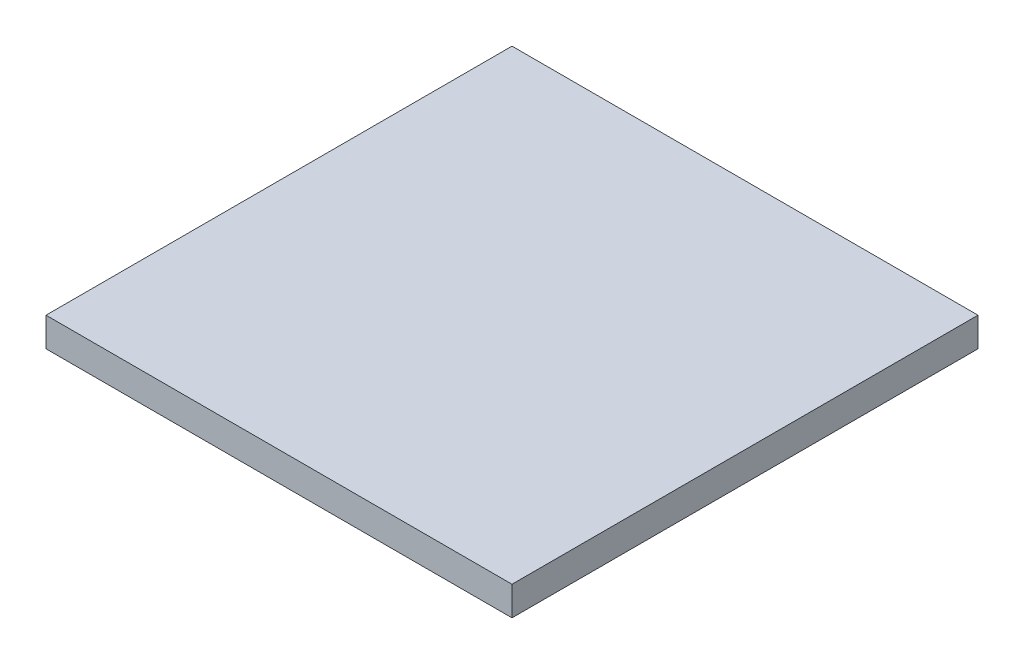
ISO-10303-21;
HEADER;
FILE_DESCRIPTION(('STEP AP214'),'2;1');
FILE_NAME('part.step','',(''),(''),'','','');
FILE_SCHEMA(('AUTOMOTIVE_DESIGN { 1 0 10303 214 1 1 1 1 }'));
ENDSEC;
DATA;
#1=APPLICATION_CONTEXT('core data for automotive mechanical design processes');
#2=APPLICATION_PROTOCOL_DEFINITION('international standard','automotive_design',2000,#1);
#3=PRODUCT_CONTEXT('',#1,'mechanical');
#4=PRODUCT('Part','Part','',(#3));
#5=PRODUCT_RELATED_PRODUCT_CATEGORY('part','',(#4));
#6=PRODUCT_DEFINITION_FORMATION('','',#4);
#7=PRODUCT_DEFINITION_CONTEXT('part definition',#1,'design');
#8=PRODUCT_DEFINITION('design','',#6,#7);
#9=PRODUCT_DEFINITION_SHAPE('','',#8);
#10=(LENGTH_UNIT() NAMED_UNIT(*) SI_UNIT(.MILLI.,.METRE.));
#11=(NAMED_UNIT(*) PLANE_ANGLE_UNIT() SI_UNIT($,.RADIAN.));
#12=(NAMED_UNIT(*) SI_UNIT($,.STERADIAN.) SOLID_ANGLE_UNIT());
#13=UNCERTAINTY_MEASURE_WITH_UNIT(LENGTH_MEASURE(1.E-05),#10,'distance_accuracy_value','');
#14=(GEOMETRIC_REPRESENTATION_CONTEXT(3) GLOBAL_UNCERTAINTY_ASSIGNED_CONTEXT((#13)) GLOBAL_UNIT_ASSIGNED_CONTEXT((#10,
#11,#12)) REPRESENTATION_CONTEXT('',''));
#15=CARTESIAN_POINT('',(0.,0.,0.));
#16=DIRECTION('',(0.,0.,1.));
#17=DIRECTION('',(1.,0.,0.));
#18=AXIS2_PLACEMENT_3D('',#15,#16,#17);
#19=CARTESIAN_POINT('',(0.,1.5875,0.));
#20=DIRECTION('',(1.,0.,0.));
#21=DIRECTION('',(0.,0.,-1.));
#22=AXIS2_PLACEMENT_3D('',#19,#20,#21);
#23=PLANE('',#22);
#24=DIRECTION('',(0.,0.,1.));
#25=VECTOR('',#24,1.);
#26=CARTESIAN_POINT('',(0.,0.,0.));
#27=LINE('',#26,#25);
#28=CARTESIAN_POINT('',(0.,0.,-25.4));
#29=VERTEX_POINT('',#28);
#30=CARTESIAN_POINT('',(0.,0.,0.));
#31=VERTEX_POINT('',#30);
#32=EDGE_CURVE('E98',#29,#31,#27,.T.);
#33=ORIENTED_EDGE('',*,*,#32,.T.);
#34=DIRECTION('',(0.,-1.,0.));
#35=VECTOR('',#34,1.);
#36=CARTESIAN_POINT('',(0.,1.5875,0.));
#37=LINE('',#36,#35);
#38=CARTESIAN_POINT('',(0.,1.5875,0.));
#39=VERTEX_POINT('',#38);
#40=EDGE_CURVE('E11',#39,#31,#37,.T.);
#41=ORIENTED_EDGE('',*,*,#40,.F.);
#42=DIRECTION('',(0.,0.,1.));
#43=VECTOR('',#42,1.);
#44=CARTESIAN_POINT('',(0.,1.5875,0.));
#45=LINE('',#44,#43);
#46=CARTESIAN_POINT('',(0.,1.5875,-25.4));
#47=VERTEX_POINT('',#46);
#48=EDGE_CURVE('E86',#47,#39,#45,.T.);
#49=ORIENTED_EDGE('',*,*,#48,.F.);
#50=DIRECTION('',(0.,-1.,0.));
#51=VECTOR('',#50,1.);
#52=CARTESIAN_POINT('',(0.,1.5875,-25.4));
#53=LINE('',#52,#51);
#54=EDGE_CURVE('E94',#47,#29,#53,.T.);
#55=ORIENTED_EDGE('',*,*,#54,.T.);
#56=EDGE_LOOP('',(#33,#41,#49,#55));
#57=FACE_BOUND('',#56,.T.);
#58=ADVANCED_FACE('F35',(#57),#23,.F.);
#59=CARTESIAN_POINT('',(0.,1.5875,0.));
#60=DIRECTION('',(0.,0.,-1.));
#61=DIRECTION('',(-1.,0.,0.));
#62=AXIS2_PLACEMENT_3D('',#59,#60,#61);
#63=PLANE('',#62);
#64=DIRECTION('',(1.,0.,0.));
#65=VECTOR('',#64,1.);
#66=CARTESIAN_POINT('',(0.,0.,0.));
#67=LINE('',#66,#65);
#68=CARTESIAN_POINT('',(25.4,0.,0.));
#69=VERTEX_POINT('',#68);
#70=EDGE_CURVE('E90',#31,#69,#67,.T.);
#71=ORIENTED_EDGE('',*,*,#70,.T.);
#72=DIRECTION('',(0.,-1.,0.));
#73=VECTOR('',#72,1.);
#74=CARTESIAN_POINT('',(25.4,1.5875,0.));
#75=LINE('',#74,#73);
#76=CARTESIAN_POINT('',(25.4,1.5875,0.));
#77=VERTEX_POINT('',#76);
#78=EDGE_CURVE('E43',#77,#69,#75,.T.);
#79=ORIENTED_EDGE('',*,*,#78,.F.);
#80=DIRECTION('',(1.,0.,0.));
#81=VECTOR('',#80,1.);
#82=CARTESIAN_POINT('',(0.,1.5875,0.));
#83=LINE('',#82,#81);
#84=EDGE_CURVE('E81',#39,#77,#83,.T.);
#85=ORIENTED_EDGE('',*,*,#84,.F.);
#86=ORIENTED_EDGE('',*,*,#40,.T.);
#87=EDGE_LOOP('',(#71,#79,#85,#86));
#88=FACE_BOUND('',#87,.T.);
#89=ADVANCED_FACE('F89',(#88),#63,.F.);
#90=CARTESIAN_POINT('',(25.4,1.5875,0.));
#91=DIRECTION('',(-1.,0.,0.));
#92=DIRECTION('',(0.,0.,1.));
#93=AXIS2_PLACEMENT_3D('',#90,#91,#92);
#94=PLANE('',#93);
#95=DIRECTION('',(0.,0.,-1.));
#96=VECTOR('',#95,1.);
#97=CARTESIAN_POINT('',(25.4,0.,0.));
#98=LINE('',#97,#96);
#99=CARTESIAN_POINT('',(25.4,0.,-25.4));
#100=VERTEX_POINT('',#99);
#101=EDGE_CURVE('E68',#69,#100,#98,.T.);
#102=ORIENTED_EDGE('',*,*,#101,.T.);
#103=DIRECTION('',(0.,-1.,0.));
#104=VECTOR('',#103,1.);
#105=CARTESIAN_POINT('',(25.4,1.5875,-25.4));
#106=LINE('',#105,#104);
#107=CARTESIAN_POINT('',(25.4,1.5875,-25.4));
#108=VERTEX_POINT('',#107);
#109=EDGE_CURVE('E91',#108,#100,#106,.T.);
#110=ORIENTED_EDGE('',*,*,#109,.F.);
#111=DIRECTION('',(0.,0.,-1.));
#112=VECTOR('',#111,1.);
#113=CARTESIAN_POINT('',(25.4,1.5875,0.));
#114=LINE('',#113,#112);
#115=EDGE_CURVE('E84',#77,#108,#114,.T.);
#116=ORIENTED_EDGE('',*,*,#115,.F.);
#117=ORIENTED_EDGE('',*,*,#78,.T.);
#118=EDGE_LOOP('',(#102,#110,#116,#117));
#119=FACE_BOUND('',#118,.T.);
#120=ADVANCED_FACE('F92',(#119),#94,.F.);
#121=CARTESIAN_POINT('',(0.,1.5875,-25.4));
#122=DIRECTION('',(0.,0.,1.));
#123=DIRECTION('',(1.,0.,0.));
#124=AXIS2_PLACEMENT_3D('',#121,#122,#123);
#125=PLANE('',#124);
#126=DIRECTION('',(-1.,0.,0.));
#127=VECTOR('',#126,1.);
#128=CARTESIAN_POINT('',(0.,0.,-25.4));
#129=LINE('',#128,#127);
#130=EDGE_CURVE('E74',#100,#29,#129,.T.);
#131=ORIENTED_EDGE('',*,*,#130,.T.);
#132=ORIENTED_EDGE('',*,*,#54,.F.);
#133=DIRECTION('',(-1.,0.,0.));
#134=VECTOR('',#133,1.);
#135=CARTESIAN_POINT('',(0.,1.5875,-25.4));
#136=LINE('',#135,#134);
#137=EDGE_CURVE('E51',#108,#47,#136,.T.);
#138=ORIENTED_EDGE('',*,*,#137,.F.);
#139=ORIENTED_EDGE('',*,*,#109,.T.);
#140=EDGE_LOOP('',(#131,#132,#138,#139));
#141=FACE_BOUND('',#140,.T.);
#142=ADVANCED_FACE('F105',(#141),#125,.F.);
#143=CARTESIAN_POINT('',(0.,1.5875,0.));
#144=DIRECTION('',(0.,-1.,0.));
#145=DIRECTION('',(0.,0.,-1.));
#146=AXIS2_PLACEMENT_3D('',#143,#144,#145);
#147=PLANE('',#146);
#148=ORIENTED_EDGE('',*,*,#48,.T.);
#149=ORIENTED_EDGE('',*,*,#84,.T.);
#150=ORIENTED_EDGE('',*,*,#115,.T.);
#151=ORIENTED_EDGE('',*,*,#137,.T.);
#152=EDGE_LOOP('',(#148,#149,#150,#151));
#153=FACE_BOUND('',#152,.T.);
#154=ADVANCED_FACE('F82',(#153),#147,.F.);
#155=CARTESIAN_POINT('',(0.,0.,0.));
#156=DIRECTION('',(0.,-1.,0.));
#157=DIRECTION('',(0.,0.,-1.));
#158=AXIS2_PLACEMENT_3D('',#155,#156,#157);
#159=PLANE('',#158);
#160=ORIENTED_EDGE('',*,*,#32,.F.);
#161=ORIENTED_EDGE('',*,*,#130,.F.);
#162=ORIENTED_EDGE('',*,*,#101,.F.);
#163=ORIENTED_EDGE('',*,*,#70,.F.);
#164=EDGE_LOOP('',(#160,#161,#162,#163));
#165=FACE_BOUND('',#164,.T.);
#166=ADVANCED_FACE('F108',(#165),#159,.T.);
#167=CLOSED_SHELL('',(#58,#89,#120,#142,#154,#166));
#168=MANIFOLD_SOLID_BREP('B2',#167);
#169=ADVANCED_BREP_SHAPE_REPRESENTATION('',(#18,#168),#14);
#170=SHAPE_DEFINITION_REPRESENTATION(#9,#169);
ENDSEC;
END-ISO-10303-21;
